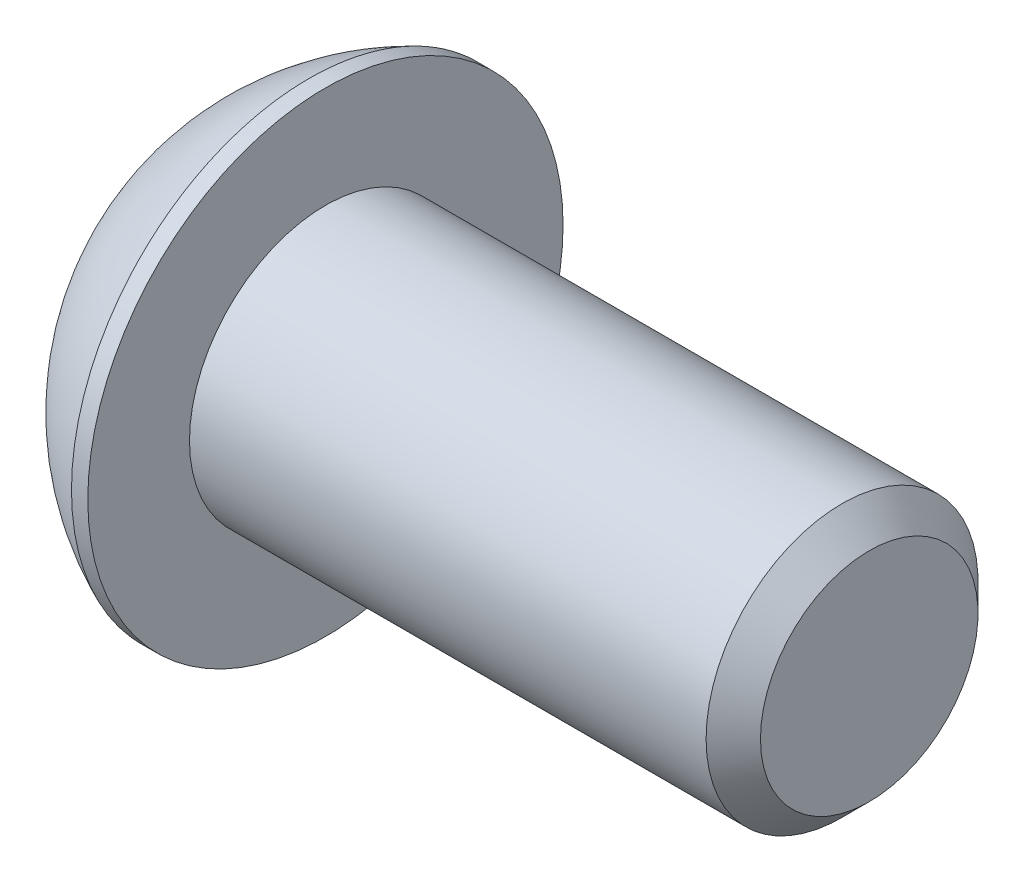
ISO-10303-21;
HEADER;
FILE_DESCRIPTION(('STEP AP214'),'2;1');
FILE_NAME('part.step','',(''),(''),'','','');
FILE_SCHEMA(('AUTOMOTIVE_DESIGN { 1 0 10303 214 1 1 1 1 }'));
ENDSEC;
DATA;
#1=APPLICATION_CONTEXT('core data for automotive mechanical design processes');
#2=APPLICATION_PROTOCOL_DEFINITION('international standard','automotive_design',2000,#1);
#3=PRODUCT_CONTEXT('',#1,'mechanical');
#4=PRODUCT('Part','Part','',(#3));
#5=PRODUCT_RELATED_PRODUCT_CATEGORY('part','',(#4));
#6=PRODUCT_DEFINITION_FORMATION('','',#4);
#7=PRODUCT_DEFINITION_CONTEXT('part definition',#1,'design');
#8=PRODUCT_DEFINITION('design','',#6,#7);
#9=PRODUCT_DEFINITION_SHAPE('','',#8);
#10=(LENGTH_UNIT() NAMED_UNIT(*) SI_UNIT(.MILLI.,.METRE.));
#11=(NAMED_UNIT(*) PLANE_ANGLE_UNIT() SI_UNIT($,.RADIAN.));
#12=(NAMED_UNIT(*) SI_UNIT($,.STERADIAN.) SOLID_ANGLE_UNIT());
#13=UNCERTAINTY_MEASURE_WITH_UNIT(LENGTH_MEASURE(1.E-05),#10,'distance_accuracy_value','');
#14=(GEOMETRIC_REPRESENTATION_CONTEXT(3) GLOBAL_UNCERTAINTY_ASSIGNED_CONTEXT((#13)) GLOBAL_UNIT_ASSIGNED_CONTEXT((#10,
#11,#12)) REPRESENTATION_CONTEXT('',''));
#15=CARTESIAN_POINT('',(0.,0.,0.));
#16=DIRECTION('',(0.,0.,1.));
#17=DIRECTION('',(1.,0.,0.));
#18=AXIS2_PLACEMENT_3D('',#15,#16,#17);
#19=CARTESIAN_POINT('',(1.32080000000034,0.,0.));
#20=DIRECTION('',(-1.,0.,0.));
#21=DIRECTION('',(0.,0.,1.));
#22=AXIS2_PLACEMENT_3D('',#19,#20,#21);
#23=CONICAL_SURFACE('',#22,1.1937999999998,1.04719755119608);
#24=CARTESIAN_POINT('',(2.01004075135902,0.,4.44089209850063E-13));
#25=VERTEX_POINT('',#24);
#26=VERTEX_LOOP('',#25);
#27=FACE_BOUND('',#26,.T.);
#28=CARTESIAN_POINT('',(1.32080000000009,0.,0.));
#29=DIRECTION('',(-1.,0.,0.));
#30=DIRECTION('',(0.,0.,1.));
#31=AXIS2_PLACEMENT_3D('',#28,#29,#30);
#32=CIRCLE('',#31,1.19380000000024);
#33=CARTESIAN_POINT('',(1.32080000000004,-1.03386112703797,0.59690000000006));
#34=VERTEX_POINT('',#33);
#35=CARTESIAN_POINT('',(1.32080000000004,0.,1.19380000000012));
#36=VERTEX_POINT('',#35);
#37=EDGE_CURVE('E20',#34,#36,#32,.T.);
#38=ORIENTED_EDGE('',*,*,#37,.T.);
#39=CARTESIAN_POINT('',(1.32080000000009,0.,0.));
#40=DIRECTION('',(-1.,0.,0.));
#41=DIRECTION('',(0.,0.,1.));
#42=AXIS2_PLACEMENT_3D('',#39,#40,#41);
#43=CIRCLE('',#42,1.19380000000024);
#44=CARTESIAN_POINT('',(1.32080000000004,1.03386112703797,0.596900000000061));
#45=VERTEX_POINT('',#44);
#46=EDGE_CURVE('E149',#36,#45,#43,.T.);
#47=ORIENTED_EDGE('',*,*,#46,.T.);
#48=CARTESIAN_POINT('',(1.32080000000009,0.,0.));
#49=DIRECTION('',(-1.,0.,0.));
#50=DIRECTION('',(0.,0.,1.));
#51=AXIS2_PLACEMENT_3D('',#48,#49,#50);
#52=CIRCLE('',#51,1.19380000000024);
#53=CARTESIAN_POINT('',(1.32080000000004,1.03386112703797,-0.596900000000061));
#54=VERTEX_POINT('',#53);
#55=EDGE_CURVE('E446',#45,#54,#52,.T.);
#56=ORIENTED_EDGE('',*,*,#55,.T.);
#57=CARTESIAN_POINT('',(1.32080000000009,0.,0.));
#58=DIRECTION('',(-1.,0.,0.));
#59=DIRECTION('',(0.,0.,1.));
#60=AXIS2_PLACEMENT_3D('',#57,#58,#59);
#61=CIRCLE('',#60,1.19380000000024);
#62=CARTESIAN_POINT('',(1.32080000000004,1.49457637585666E-12,-1.19380000000012));
#63=VERTEX_POINT('',#62);
#64=EDGE_CURVE('E447',#54,#63,#61,.T.);
#65=ORIENTED_EDGE('',*,*,#64,.T.);
#66=CARTESIAN_POINT('',(1.32080000000009,0.,0.));
#67=DIRECTION('',(-1.,0.,0.));
#68=DIRECTION('',(0.,0.,1.));
#69=AXIS2_PLACEMENT_3D('',#66,#67,#68);
#70=CIRCLE('',#69,1.19380000000024);
#71=CARTESIAN_POINT('',(1.32080000000004,-1.03386112703797,-0.59690000000006));
#72=VERTEX_POINT('',#71);
#73=EDGE_CURVE('E93',#63,#72,#70,.T.);
#74=ORIENTED_EDGE('',*,*,#73,.T.);
#75=CARTESIAN_POINT('',(1.32080000000009,0.,0.));
#76=DIRECTION('',(-1.,0.,0.));
#77=DIRECTION('',(0.,0.,1.));
#78=AXIS2_PLACEMENT_3D('',#75,#76,#77);
#79=CIRCLE('',#78,1.19380000000024);
#80=EDGE_CURVE('E89',#72,#34,#79,.T.);
#81=ORIENTED_EDGE('',*,*,#80,.T.);
#82=EDGE_LOOP('',(#38,#47,#56,#65,#74,#81));
#83=FACE_BOUND('',#82,.T.);
#84=ADVANCED_FACE('F17',(#27,#83),#23,.F.);
#85=CARTESIAN_POINT('',(1.3208,-2.06772225407572,-1.1938));
#86=DIRECTION('',(1.,0.,0.));
#87=DIRECTION('',(0.,0.,-1.));
#88=AXIS2_PLACEMENT_3D('',#85,#86,#87);
#89=PLANE('',#88);
#90=DIRECTION('',(0.,0.5,0.866025403784439));
#91=VECTOR('',#90,1.);
#92=CARTESIAN_POINT('',(1.3208,-1.37848150271715,0.));
#93=LINE('',#92,#91);
#94=CARTESIAN_POINT('',(1.3208,-0.689240751358574,1.1938));
#95=VERTEX_POINT('',#94);
#96=EDGE_CURVE('E101',#95,#34,#93,.F.);
#97=ORIENTED_EDGE('',*,*,#96,.F.);
#98=DIRECTION('',(0.,1.,0.));
#99=VECTOR('',#98,1.);
#100=CARTESIAN_POINT('',(1.3208,-0.689240751358574,1.1938));
#101=LINE('',#100,#99);
#102=EDGE_CURVE('E103',#36,#95,#101,.F.);
#103=ORIENTED_EDGE('',*,*,#102,.F.);
#104=ORIENTED_EDGE('',*,*,#37,.F.);
#105=EDGE_LOOP('',(#97,#103,#104));
#106=FACE_BOUND('',#105,.T.);
#107=ADVANCED_FACE('F99',(#106),#89,.F.);
#108=CARTESIAN_POINT('',(1.3208,-2.06772225407572,-1.1938));
#109=DIRECTION('',(1.,0.,0.));
#110=DIRECTION('',(0.,0.,-1.));
#111=AXIS2_PLACEMENT_3D('',#108,#109,#110);
#112=PLANE('',#111);
#113=DIRECTION('',(0.,-0.5,0.866025403784439));
#114=VECTOR('',#113,1.);
#115=CARTESIAN_POINT('',(1.3208,-0.689240751358574,-1.1938));
#116=LINE('',#115,#114);
#117=CARTESIAN_POINT('',(1.3208,-1.37848150271715,0.));
#118=VERTEX_POINT('',#117);
#119=EDGE_CURVE('E109',#118,#72,#116,.F.);
#120=ORIENTED_EDGE('',*,*,#119,.F.);
#121=DIRECTION('',(0.,0.5,0.866025403784439));
#122=VECTOR('',#121,1.);
#123=CARTESIAN_POINT('',(1.3208,-1.37848150271715,0.));
#124=LINE('',#123,#122);
#125=EDGE_CURVE('E106',#34,#118,#124,.F.);
#126=ORIENTED_EDGE('',*,*,#125,.F.);
#127=ORIENTED_EDGE('',*,*,#80,.F.);
#128=EDGE_LOOP('',(#120,#126,#127));
#129=FACE_BOUND('',#128,.T.);
#130=ADVANCED_FACE('F107',(#129),#112,.F.);
#131=CARTESIAN_POINT('',(1.3208,-2.06772225407572,-1.1938));
#132=DIRECTION('',(1.,0.,0.));
#133=DIRECTION('',(0.,0.,-1.));
#134=AXIS2_PLACEMENT_3D('',#131,#132,#133);
#135=PLANE('',#134);
#136=DIRECTION('',(0.,1.,0.));
#137=VECTOR('',#136,1.);
#138=CARTESIAN_POINT('',(1.3208,0.689240751358577,-1.1938));
#139=LINE('',#138,#137);
#140=CARTESIAN_POINT('',(1.3208,-0.689240751358574,-1.1938));
#141=VERTEX_POINT('',#140);
#142=EDGE_CURVE('E417',#141,#63,#139,.T.);
#143=ORIENTED_EDGE('',*,*,#142,.F.);
#144=DIRECTION('',(0.,-0.5,0.866025403784439));
#145=VECTOR('',#144,1.);
#146=CARTESIAN_POINT('',(1.3208,-0.689240751358574,-1.1938));
#147=LINE('',#146,#145);
#148=EDGE_CURVE('E429',#72,#141,#147,.F.);
#149=ORIENTED_EDGE('',*,*,#148,.F.);
#150=ORIENTED_EDGE('',*,*,#73,.F.);
#151=EDGE_LOOP('',(#143,#149,#150));
#152=FACE_BOUND('',#151,.T.);
#153=ADVANCED_FACE('F192',(#152),#135,.F.);
#154=CARTESIAN_POINT('',(1.3208,-2.06772225407572,-1.1938));
#155=DIRECTION('',(1.,0.,0.));
#156=DIRECTION('',(0.,0.,-1.));
#157=AXIS2_PLACEMENT_3D('',#154,#155,#156);
#158=PLANE('',#157);
#159=DIRECTION('',(0.,-0.5,-0.866025403784439));
#160=VECTOR('',#159,1.);
#161=CARTESIAN_POINT('',(1.3208,1.37848150271715,0.));
#162=LINE('',#161,#160);
#163=CARTESIAN_POINT('',(1.3208,0.689240751358576,-1.1938));
#164=VERTEX_POINT('',#163);
#165=EDGE_CURVE('E403',#164,#54,#162,.F.);
#166=ORIENTED_EDGE('',*,*,#165,.F.);
#167=DIRECTION('',(0.,1.,0.));
#168=VECTOR('',#167,1.);
#169=CARTESIAN_POINT('',(1.3208,0.689240751358577,-1.1938));
#170=LINE('',#169,#168);
#171=EDGE_CURVE('E414',#63,#164,#170,.T.);
#172=ORIENTED_EDGE('',*,*,#171,.F.);
#173=ORIENTED_EDGE('',*,*,#64,.F.);
#174=EDGE_LOOP('',(#166,#172,#173));
#175=FACE_BOUND('',#174,.T.);
#176=ADVANCED_FACE('F188',(#175),#158,.F.);
#177=CARTESIAN_POINT('',(1.3208,-2.06772225407572,-1.1938));
#178=DIRECTION('',(1.,0.,0.));
#179=DIRECTION('',(0.,0.,-1.));
#180=AXIS2_PLACEMENT_3D('',#177,#178,#179);
#181=PLANE('',#180);
#182=DIRECTION('',(0.,0.5,-0.866025403784439));
#183=VECTOR('',#182,1.);
#184=CARTESIAN_POINT('',(1.3208,0.689240751358577,1.1938));
#185=LINE('',#184,#183);
#186=CARTESIAN_POINT('',(1.3208,1.37848150271715,0.));
#187=VERTEX_POINT('',#186);
#188=EDGE_CURVE('E382',#187,#45,#185,.F.);
#189=ORIENTED_EDGE('',*,*,#188,.F.);
#190=DIRECTION('',(0.,-0.5,-0.866025403784439));
#191=VECTOR('',#190,1.);
#192=CARTESIAN_POINT('',(1.3208,1.37848150271715,0.));
#193=LINE('',#192,#191);
#194=EDGE_CURVE('E401',#54,#187,#193,.F.);
#195=ORIENTED_EDGE('',*,*,#194,.F.);
#196=ORIENTED_EDGE('',*,*,#55,.F.);
#197=EDGE_LOOP('',(#189,#195,#196));
#198=FACE_BOUND('',#197,.T.);
#199=ADVANCED_FACE('F184',(#198),#181,.F.);
#200=CARTESIAN_POINT('',(1.3208,-2.06772225407572,-1.1938));
#201=DIRECTION('',(1.,0.,0.));
#202=DIRECTION('',(0.,0.,-1.));
#203=AXIS2_PLACEMENT_3D('',#200,#201,#202);
#204=PLANE('',#203);
#205=DIRECTION('',(0.,1.,0.));
#206=VECTOR('',#205,1.);
#207=CARTESIAN_POINT('',(1.3208,-0.689240751358574,1.1938));
#208=LINE('',#207,#206);
#209=CARTESIAN_POINT('',(1.3208,0.689240751358577,1.1938));
#210=VERTEX_POINT('',#209);
#211=EDGE_CURVE('E118',#210,#36,#208,.F.);
#212=ORIENTED_EDGE('',*,*,#211,.F.);
#213=DIRECTION('',(0.,0.5,-0.866025403784439));
#214=VECTOR('',#213,1.);
#215=CARTESIAN_POINT('',(1.3208,0.689240751358577,1.1938));
#216=LINE('',#215,#214);
#217=EDGE_CURVE('E385',#45,#210,#216,.F.);
#218=ORIENTED_EDGE('',*,*,#217,.F.);
#219=ORIENTED_EDGE('',*,*,#46,.F.);
#220=EDGE_LOOP('',(#212,#218,#219));
#221=FACE_BOUND('',#220,.T.);
#222=ADVANCED_FACE('F180',(#221),#204,.F.);
#223=CARTESIAN_POINT('',(1.3208,-0.689240751358574,1.1938));
#224=DIRECTION('',(0.,0.,-1.));
#225=DIRECTION('',(0.,1.,0.));
#226=AXIS2_PLACEMENT_3D('',#223,#224,#225);
#227=PLANE('',#226);
#228=DIRECTION('',(0.,1.,0.));
#229=VECTOR('',#228,1.);
#230=CARTESIAN_POINT('',(0.,0.,1.1938));
#231=LINE('',#230,#229);
#232=CARTESIAN_POINT('',(0.,0.689240751358577,1.1938));
#233=VERTEX_POINT('',#232);
#234=CARTESIAN_POINT('',(0.,-0.689240751358574,1.1938));
#235=VERTEX_POINT('',#234);
#236=EDGE_CURVE('E379',#233,#235,#231,.F.);
#237=ORIENTED_EDGE('',*,*,#236,.F.);
#238=DIRECTION('',(1.,0.,0.));
#239=VECTOR('',#238,1.);
#240=CARTESIAN_POINT('',(1.3208,0.689240751358577,1.1938));
#241=LINE('',#240,#239);
#242=EDGE_CURVE('E391',#210,#233,#241,.F.);
#243=ORIENTED_EDGE('',*,*,#242,.F.);
#244=ORIENTED_EDGE('',*,*,#211,.T.);
#245=ORIENTED_EDGE('',*,*,#102,.T.);
#246=DIRECTION('',(1.,0.,0.));
#247=VECTOR('',#246,1.);
#248=CARTESIAN_POINT('',(1.3208,-0.689240751358574,1.1938));
#249=LINE('',#248,#247);
#250=EDGE_CURVE('E112',#235,#95,#249,.T.);
#251=ORIENTED_EDGE('',*,*,#250,.F.);
#252=EDGE_LOOP('',(#237,#243,#244,#245,#251));
#253=FACE_BOUND('',#252,.T.);
#254=ADVANCED_FACE('F177',(#253),#227,.T.);
#255=CARTESIAN_POINT('',(1.3208,-1.37848150271715,0.));
#256=DIRECTION('',(0.,0.866025403784439,-0.5));
#257=DIRECTION('',(0.,0.5,0.866025403784439));
#258=AXIS2_PLACEMENT_3D('',#255,#256,#257);
#259=PLANE('',#258);
#260=DIRECTION('',(0.,-0.5,-0.866025403784439));
#261=VECTOR('',#260,1.);
#262=CARTESIAN_POINT('',(0.,-0.689240751358574,1.1938));
#263=LINE('',#262,#261);
#264=CARTESIAN_POINT('',(0.,-1.37848150271715,0.));
#265=VERTEX_POINT('',#264);
#266=EDGE_CURVE('E376',#235,#265,#263,.T.);
#267=ORIENTED_EDGE('',*,*,#266,.F.);
#268=ORIENTED_EDGE('',*,*,#250,.T.);
#269=ORIENTED_EDGE('',*,*,#96,.T.);
#270=ORIENTED_EDGE('',*,*,#125,.T.);
#271=DIRECTION('',(1.,0.,0.));
#272=VECTOR('',#271,1.);
#273=CARTESIAN_POINT('',(1.3208,-1.37848150271715,0.));
#274=LINE('',#273,#272);
#275=EDGE_CURVE('E426',#265,#118,#274,.T.);
#276=ORIENTED_EDGE('',*,*,#275,.F.);
#277=EDGE_LOOP('',(#267,#268,#269,#270,#276));
#278=FACE_BOUND('',#277,.T.);
#279=ADVANCED_FACE('F116',(#278),#259,.T.);
#280=CARTESIAN_POINT('',(1.3208,-0.689240751358574,-1.1938));
#281=DIRECTION('',(0.,0.866025403784439,0.5));
#282=DIRECTION('',(0.,-0.5,0.866025403784439));
#283=AXIS2_PLACEMENT_3D('',#280,#281,#282);
#284=PLANE('',#283);
#285=DIRECTION('',(0.,0.5,-0.866025403784439));
#286=VECTOR('',#285,1.);
#287=CARTESIAN_POINT('',(0.,-1.37848150271715,0.));
#288=LINE('',#287,#286);
#289=CARTESIAN_POINT('',(0.,-0.689240751358574,-1.1938));
#290=VERTEX_POINT('',#289);
#291=EDGE_CURVE('E373',#265,#290,#288,.T.);
#292=ORIENTED_EDGE('',*,*,#291,.F.);
#293=ORIENTED_EDGE('',*,*,#275,.T.);
#294=ORIENTED_EDGE('',*,*,#119,.T.);
#295=ORIENTED_EDGE('',*,*,#148,.T.);
#296=DIRECTION('',(1.,0.,0.));
#297=VECTOR('',#296,1.);
#298=CARTESIAN_POINT('',(1.3208,-0.689240751358574,-1.1938));
#299=LINE('',#298,#297);
#300=EDGE_CURVE('E411',#290,#141,#299,.T.);
#301=ORIENTED_EDGE('',*,*,#300,.F.);
#302=EDGE_LOOP('',(#292,#293,#294,#295,#301));
#303=FACE_BOUND('',#302,.T.);
#304=ADVANCED_FACE('F170',(#303),#284,.T.);
#305=CARTESIAN_POINT('',(1.3208,0.689240751358577,-1.1938));
#306=DIRECTION('',(0.,0.,1.));
#307=DIRECTION('',(1.,0.,0.));
#308=AXIS2_PLACEMENT_3D('',#305,#306,#307);
#309=PLANE('',#308);
#310=DIRECTION('',(0.,1.,0.));
#311=VECTOR('',#310,1.);
#312=CARTESIAN_POINT('',(0.,0.,-1.1938));
#313=LINE('',#312,#311);
#314=CARTESIAN_POINT('',(0.,0.689240751358577,-1.1938));
#315=VERTEX_POINT('',#314);
#316=EDGE_CURVE('E370',#290,#315,#313,.T.);
#317=ORIENTED_EDGE('',*,*,#316,.F.);
#318=ORIENTED_EDGE('',*,*,#300,.T.);
#319=ORIENTED_EDGE('',*,*,#142,.T.);
#320=ORIENTED_EDGE('',*,*,#171,.T.);
#321=DIRECTION('',(1.,0.,0.));
#322=VECTOR('',#321,1.);
#323=CARTESIAN_POINT('',(1.3208,0.689240751358576,-1.1938));
#324=LINE('',#323,#322);
#325=EDGE_CURVE('E386',#315,#164,#324,.T.);
#326=ORIENTED_EDGE('',*,*,#325,.F.);
#327=EDGE_LOOP('',(#317,#318,#319,#320,#326));
#328=FACE_BOUND('',#327,.T.);
#329=ADVANCED_FACE('F167',(#328),#309,.T.);
#330=CARTESIAN_POINT('',(1.3208,1.37848150271715,0.));
#331=DIRECTION('',(0.,-0.866025403784439,0.5));
#332=DIRECTION('',(0.,-0.5,-0.866025403784439));
#333=AXIS2_PLACEMENT_3D('',#330,#331,#332);
#334=PLANE('',#333);
#335=DIRECTION('',(0.,0.5,0.866025403784439));
#336=VECTOR('',#335,1.);
#337=CARTESIAN_POINT('',(0.,0.689240751358577,-1.1938));
#338=LINE('',#337,#336);
#339=CARTESIAN_POINT('',(0.,1.37848150271715,0.));
#340=VERTEX_POINT('',#339);
#341=EDGE_CURVE('E367',#315,#340,#338,.T.);
#342=ORIENTED_EDGE('',*,*,#341,.F.);
#343=ORIENTED_EDGE('',*,*,#325,.T.);
#344=ORIENTED_EDGE('',*,*,#165,.T.);
#345=ORIENTED_EDGE('',*,*,#194,.T.);
#346=DIRECTION('',(1.,0.,0.));
#347=VECTOR('',#346,1.);
#348=CARTESIAN_POINT('',(1.3208,1.37848150271715,0.));
#349=LINE('',#348,#347);
#350=EDGE_CURVE('E35',#340,#187,#349,.T.);
#351=ORIENTED_EDGE('',*,*,#350,.F.);
#352=EDGE_LOOP('',(#342,#343,#344,#345,#351));
#353=FACE_BOUND('',#352,.T.);
#354=ADVANCED_FACE('F163',(#353),#334,.T.);
#355=CARTESIAN_POINT('',(1.3208,0.689240751358577,1.1938));
#356=DIRECTION('',(0.,-0.866025403784439,-0.5));
#357=DIRECTION('',(0.,0.5,-0.866025403784439));
#358=AXIS2_PLACEMENT_3D('',#355,#356,#357);
#359=PLANE('',#358);
#360=DIRECTION('',(0.,-0.5,0.866025403784439));
#361=VECTOR('',#360,1.);
#362=CARTESIAN_POINT('',(0.,1.37848150271715,0.));
#363=LINE('',#362,#361);
#364=EDGE_CURVE('E148',#340,#233,#363,.T.);
#365=ORIENTED_EDGE('',*,*,#364,.F.);
#366=ORIENTED_EDGE('',*,*,#350,.T.);
#367=ORIENTED_EDGE('',*,*,#188,.T.);
#368=ORIENTED_EDGE('',*,*,#217,.T.);
#369=ORIENTED_EDGE('',*,*,#242,.T.);
#370=EDGE_LOOP('',(#365,#366,#367,#368,#369));
#371=FACE_BOUND('',#370,.T.);
#372=ADVANCED_FACE('F159',(#371),#359,.T.);
#373=CARTESIAN_POINT('',(0.,0.,0.));
#374=DIRECTION('',(-1.,0.,0.));
#375=DIRECTION('',(0.,0.,1.));
#376=AXIS2_PLACEMENT_3D('',#373,#374,#375);
#377=PLANE('',#376);
#378=ORIENTED_EDGE('',*,*,#341,.T.);
#379=ORIENTED_EDGE('',*,*,#364,.T.);
#380=ORIENTED_EDGE('',*,*,#236,.T.);
#381=ORIENTED_EDGE('',*,*,#266,.T.);
#382=ORIENTED_EDGE('',*,*,#291,.T.);
#383=ORIENTED_EDGE('',*,*,#316,.T.);
#384=EDGE_LOOP('',(#378,#379,#380,#381,#382,#383));
#385=FACE_BOUND('',#384,.T.);
#386=CARTESIAN_POINT('',(0.,2.77495,0.));
#387=CARTESIAN_POINT('',(0.,2.77494953309947,0.077911893752346));
#388=CARTESIAN_POINT('',(0.,2.77166578388025,0.15583810591977));
#389=CARTESIAN_POINT('',(0.,2.75855213600204,0.311152012455904));
#390=CARTESIAN_POINT('',(0.,2.74872030471467,0.388539541019557));
#391=CARTESIAN_POINT('',(0.,2.72255472645677,0.542341518735718));
#392=CARTESIAN_POINT('',(-2.70127737992528E-13,2.70621065843662,0.618754223567578));
#393=CARTESIAN_POINT('',(2.712151197605E-13,2.66713326915777,0.769973634286023));
#394=CARTESIAN_POINT('',(1.01146133440994E-12,2.64439476297869,0.844778983646282));
#395=CARTESIAN_POINT('',(1.81647393794152E-12,2.5669019594335,1.06566239301792));
#396=CARTESIAN_POINT('',(4.75774730692854E-13,2.50280672569928,1.20857954243987));
#397=CARTESIAN_POINT('',(-4.74925440591424E-13,2.35149826934097,1.48160874561538));
#398=CARTESIAN_POINT('',(0.,2.26428416790397,1.61172031233499));
#399=CARTESIAN_POINT('',(0.,2.1181093928834,1.79445660654268));
#400=CARTESIAN_POINT('',(0.,2.06678693791626,1.85333128513996));
#401=CARTESIAN_POINT('',(0.,1.95940522984449,1.96650727912792));
#402=CARTESIAN_POINT('',(0.,1.90335059143535,2.02081294920044));
#403=CARTESIAN_POINT('',(0.,1.78683891013962,2.12453280878582));
#404=CARTESIAN_POINT('',(0.,1.72637988450322,2.1739447713554));
#405=CARTESIAN_POINT('',(0.,1.6015196886571,2.26750481692908));
#406=CARTESIAN_POINT('',(0.,1.53711760864537,2.31165167810847));
#407=CARTESIAN_POINT('',(0.,1.33869902291632,2.43567242603944));
#408=CARTESIAN_POINT('',(0.,1.19934704110695,2.507235886628));
#409=CARTESIAN_POINT('',(0.,0.910681609121878,2.62590828672821));
#410=CARTESIAN_POINT('',(0.,0.761368265357396,2.67301748742278));
#411=CARTESIAN_POINT('',(0.,0.456932649466621,2.74151230664007));
#412=CARTESIAN_POINT('',(0.,0.301810346322582,2.76289778778721));
#413=CARTESIAN_POINT('',(0.,-0.00982263870895374,2.77931595661155));
#414=CARTESIAN_POINT('',(0.,-0.16633332059645,2.77434864428876));
#415=CARTESIAN_POINT('',(0.,-0.476280836814454,2.73822217653072));
#416=CARTESIAN_POINT('',(0.,-0.629717687555988,2.70706316096981));
#417=CARTESIAN_POINT('',(0.,-0.929254830044276,2.61937980771149));
#418=CARTESIAN_POINT('',(0.,-1.0753550434132,2.56285519909568));
#419=CARTESIAN_POINT('',(0.,-1.28570692598579,2.46037024128109));
#420=CARTESIAN_POINT('',(0.,-1.35439130022287,2.42323494812896));
#421=CARTESIAN_POINT('',(0.,-1.488391287199,2.34331277270256));
#422=CARTESIAN_POINT('',(0.,-1.55370767631787,2.30052720108831));
#423=CARTESIAN_POINT('',(0.,-1.68047292776594,2.20962421887055));
#424=CARTESIAN_POINT('',(0.,-1.7419235278682,2.16150923122348));
#425=CARTESIAN_POINT('',(0.,-1.86060297067992,2.06024311301283));
#426=CARTESIAN_POINT('',(0.,-1.91782768181716,2.0070871669763));
#427=CARTESIAN_POINT('',(0.,-2.08239462196651,1.8407220856554));
#428=CARTESIAN_POINT('',(0.,-2.18279764272601,1.72049499758422));
#429=CARTESIAN_POINT('',(0.,-2.36195754944064,1.46487629213018));
#430=CARTESIAN_POINT('',(0.,-2.44071525816758,1.32948525142808));
#431=CARTESIAN_POINT('',(0.,-2.54098882695274,1.11796734074395));
#432=CARTESIAN_POINT('',(0.,-2.57146177392727,1.04596540008347));
#433=CARTESIAN_POINT('',(0.,-2.62621251108999,0.899689259475766));
#434=CARTESIAN_POINT('',(0.,-2.65049531495563,0.825416953360954));
#435=CARTESIAN_POINT('',(0.,-2.69267708798767,0.675215808695209));
#436=CARTESIAN_POINT('',(0.,-2.71058613777937,0.599289789313093));
#437=CARTESIAN_POINT('',(0.,-2.73994710360127,0.446213628496932));
#438=CARTESIAN_POINT('',(0.,-2.75140092413871,0.369063855024788));
#439=CARTESIAN_POINT('',(0.,-2.76470470685523,0.243162088173431));
#440=CARTESIAN_POINT('',(0.,-2.76854547596618,0.194611672428577));
#441=CARTESIAN_POINT('',(0.,-2.77366826843264,0.0973760351839812));
#442=CARTESIAN_POINT('',(0.,-2.77495029178814,0.0486908136842395));
#443=CARTESIAN_POINT('',(0.,-2.77494953309947,-0.0779118937523475));
#444=CARTESIAN_POINT('',(0.,-2.77166578388025,-0.155838105919772));
#445=CARTESIAN_POINT('',(0.,-2.75855213600205,-0.311152012455906));
#446=CARTESIAN_POINT('',(0.,-2.74872030471468,-0.388539541019558));
#447=CARTESIAN_POINT('',(0.,-2.72255472645677,-0.542341518735719));
#448=CARTESIAN_POINT('',(-2.70468893306326E-13,-2.70621065843662,-0.618754223567579));
#449=CARTESIAN_POINT('',(2.71556552501148E-13,-2.66713326915777,-0.769973634286024));
#450=CARTESIAN_POINT('',(1.01276822472601E-12,-2.64439476297869,-0.844778983646283));
#451=CARTESIAN_POINT('',(1.81906228830719E-12,-2.56690195943351,-1.06566239301792));
#452=CARTESIAN_POINT('',(4.77076449237947E-13,-2.50280672569928,-1.20857954243988));
#453=CARTESIAN_POINT('',(-4.76227208625583E-13,-2.35149826934097,-1.48160874561538));
#454=CARTESIAN_POINT('',(0.,-2.26428416790397,-1.61172031233499));
#455=CARTESIAN_POINT('',(0.,-2.1181093928834,-1.79445660654268));
#456=CARTESIAN_POINT('',(0.,-2.06678693791626,-1.85333128513997));
#457=CARTESIAN_POINT('',(0.,-1.95940522984449,-1.96650727912792));
#458=CARTESIAN_POINT('',(0.,-1.90335059143535,-2.02081294920044));
#459=CARTESIAN_POINT('',(0.,-1.78683891013962,-2.12453280878582));
#460=CARTESIAN_POINT('',(0.,-1.72637988450322,-2.1739447713554));
#461=CARTESIAN_POINT('',(0.,-1.6015196886571,-2.26750481692908));
#462=CARTESIAN_POINT('',(0.,-1.53711760864537,-2.31165167810847));
#463=CARTESIAN_POINT('',(0.,-1.33869902291631,-2.43567242603944));
#464=CARTESIAN_POINT('',(0.,-1.19934704110695,-2.507235886628));
#465=CARTESIAN_POINT('',(0.,-0.910681609121877,-2.62590828672821));
#466=CARTESIAN_POINT('',(0.,-0.761368265357394,-2.67301748742278));
#467=CARTESIAN_POINT('',(0.,-0.456932649466619,-2.74151230664007));
#468=CARTESIAN_POINT('',(0.,-0.30181034632258,-2.76289778778721));
#469=CARTESIAN_POINT('',(0.,0.0098226387089554,-2.77931595661155));
#470=CARTESIAN_POINT('',(0.,0.166333320596452,-2.77434864428876));
#471=CARTESIAN_POINT('',(0.,0.476280836814455,-2.73822217653072));
#472=CARTESIAN_POINT('',(0.,0.629717687555989,-2.70706316096981));
#473=CARTESIAN_POINT('',(0.,0.929254830044277,-2.61937980771149));
#474=CARTESIAN_POINT('',(0.,1.0753550434132,-2.56285519909568));
#475=CARTESIAN_POINT('',(0.,1.28570692598579,-2.46037024128108));
#476=CARTESIAN_POINT('',(0.,1.35439130022287,-2.42323494812896));
#477=CARTESIAN_POINT('',(0.,1.488391287199,-2.34331277270255));
#478=CARTESIAN_POINT('',(0.,1.55370767631787,-2.30052720108831));
#479=CARTESIAN_POINT('',(0.,1.68047292776595,-2.20962421887055));
#480=CARTESIAN_POINT('',(0.,1.7419235278682,-2.16150923122348));
#481=CARTESIAN_POINT('',(0.,1.86060297067992,-2.06024311301282));
#482=CARTESIAN_POINT('',(0.,1.91782768181715,-2.0070871669763));
#483=CARTESIAN_POINT('',(0.,2.08239462196651,-1.84072208565539));
#484=CARTESIAN_POINT('',(0.,2.18279764272601,-1.72049499758421));
#485=CARTESIAN_POINT('',(0.,2.36195754944064,-1.46487629213018));
#486=CARTESIAN_POINT('',(0.,2.44071525816758,-1.32948525142807));
#487=CARTESIAN_POINT('',(0.,2.54098882695274,-1.11796734074395));
#488=CARTESIAN_POINT('',(0.,2.57146177392727,-1.04596540008347));
#489=CARTESIAN_POINT('',(0.,2.62621251108998,-0.899689259475763));
#490=CARTESIAN_POINT('',(0.,2.65049531495563,-0.825416953360952));
#491=CARTESIAN_POINT('',(0.,2.69267708798767,-0.675215808695206));
#492=CARTESIAN_POINT('',(0.,2.71058613777937,-0.59928978931309));
#493=CARTESIAN_POINT('',(0.,2.73994710360127,-0.446213628496929));
#494=CARTESIAN_POINT('',(0.,2.7514009241387,-0.369063855024785));
#495=CARTESIAN_POINT('',(0.,2.76470470685522,-0.243162088173428));
#496=CARTESIAN_POINT('',(0.,2.76854547596618,-0.194611672428575));
#497=CARTESIAN_POINT('',(0.,2.77366826843264,-0.0973760351839809));
#498=CARTESIAN_POINT('',(0.,2.77495029178814,-0.04869081368424));
#499=CARTESIAN_POINT('',(0.,2.77495,0.));
#500=B_SPLINE_CURVE_WITH_KNOTS('',3,(#386,#387,#388,#389,#390,#391,#392,#393,#394,#395,#396,
#397,#398,#399,#400,#401,#402,#403,#404,#405,#406,#407,#408,#409,#410,#411,#412,#413,#414,#415,
#416,#417,#418,#419,#420,#421,#422,#423,#424,#425,#426,#427,#428,#429,#430,#431,#432,#433,#434,
#435,#436,#437,#438,#439,#440,#441,#442,#443,#444,#445,#446,#447,#448,#449,#450,#451,#452,#453,
#454,#455,#456,#457,#458,#459,#460,#461,#462,#463,#464,#465,#466,#467,#468,#469,#470,#471,#472,
#473,#474,#475,#476,#477,#478,#479,#480,#481,#482,#483,#484,#485,#486,#487,#488,#489,#490,#491,
#492,#493,#494,#495,#496,#497,#498,#499),.UNSPECIFIED.,.T.,.F.,(4,2,2,2,2,2,2,2,2,2,2,2,2,2,2,2,
2,2,2,2,2,2,2,2,2,2,2,2,2,2,2,2,2,2,2,2,2,2,2,2,2,2,2,2,2,2,2,2,2,2,2,2,2,2,2,2,4),(0.,
0.233690856748163,0.467450716578751,0.701582538521472,0.935904756015416,1.40343220467667,
1.87097742791502,2.10505636898837,2.33890962270652,2.57286880998746,2.80688218486306,
3.27442101763127,3.74195485676357,4.20949119271389,4.67702752866417,5.14456136779641,
5.61210020056468,5.84611357544033,6.08007276272136,6.31392601643949,6.54800495751272,
7.01555018075071,7.48307762941212,7.71739984690652,7.95153166884954,8.18529152868022,
8.41898238542855,8.56502681353347,8.71107124163842,8.94476209838658,9.17852195821717,
9.41265378015989,9.64697599765384,10.1145034463151,10.5820486695534,10.8161276106268,
11.0499808643449,11.2839400516259,11.5179534265015,11.9854922592697,12.453026098402,
12.9205624343523,13.3880987703026,13.8556326094348,14.3231714422031,14.5571848170788,
14.7911440043598,15.0249972580779,15.2590761991511,15.7266214223891,16.1941488710505,
16.4284710885449,16.662602910488,16.8963627703186,17.130053627067,17.2760980551719,
17.4221424832768),.UNSPECIFIED.);
#501=CARTESIAN_POINT('',(0.,2.77495,0.));
#502=VERTEX_POINT('',#501);
#503=EDGE_CURVE('E140',#502,#502,#500,.T.);
#504=ORIENTED_EDGE('',*,*,#503,.F.);
#505=EDGE_LOOP('',(#504));
#506=FACE_BOUND('',#505,.T.);
#507=ADVANCED_FACE('F155',(#385,#506),#377,.T.);
#508=CARTESIAN_POINT('',(5.37260881410257,0.,0.));
#509=DIRECTION('',(0.,1.,0.));
#510=DIRECTION('',(1.,0.,0.));
#511=AXIS2_PLACEMENT_3D('',#508,#509,#510);
#512=SPHERICAL_SURFACE('',#511,6.04692260343);
#513=CARTESIAN_POINT('',(2.9718,0.,0.));
#514=DIRECTION('',(-1.,0.,0.));
#515=DIRECTION('',(0.,0.,1.));
#516=AXIS2_PLACEMENT_3D('',#513,#514,#515);
#517=CIRCLE('',#516,5.5499);
#518=CARTESIAN_POINT('',(2.9718,0.,5.5499));
#519=VERTEX_POINT('',#518);
#520=EDGE_CURVE('E137',#519,#519,#517,.F.);
#521=ORIENTED_EDGE('',*,*,#520,.F.);
#522=EDGE_LOOP('',(#521));
#523=FACE_BOUND('',#522,.T.);
#524=ORIENTED_EDGE('',*,*,#503,.T.);
#525=EDGE_LOOP('',(#524));
#526=FACE_BOUND('',#525,.T.);
#527=ADVANCED_FACE('F151',(#523,#526),#512,.T.);
#528=CARTESIAN_POINT('',(16.0528,0.,0.));
#529=DIRECTION('',(-1.,0.,0.));
#530=DIRECTION('',(0.,0.,1.));
#531=AXIS2_PLACEMENT_3D('',#528,#529,#530);
#532=PLANE('',#531);
#533=CARTESIAN_POINT('',(16.0528000000681,0.,0.));
#534=DIRECTION('',(-1.,0.,0.));
#535=DIRECTION('',(0.,0.,1.));
#536=AXIS2_PLACEMENT_3D('',#533,#534,#535);
#537=CIRCLE('',#536,2.54000000001042);
#538=CARTESIAN_POINT('',(16.0528000000681,0.,2.54000000001042));
#539=VERTEX_POINT('',#538);
#540=EDGE_CURVE('E134',#539,#539,#537,.T.);
#541=ORIENTED_EDGE('',*,*,#540,.F.);
#542=EDGE_LOOP('',(#541));
#543=FACE_BOUND('',#542,.T.);
#544=ADVANCED_FACE('F222',(#543),#532,.F.);
#545=CARTESIAN_POINT('',(0.,0.,0.));
#546=DIRECTION('',(-1.,0.,0.));
#547=DIRECTION('',(0.,0.,1.));
#548=AXIS2_PLACEMENT_3D('',#545,#546,#547);
#549=CYLINDRICAL_SURFACE('',#548,5.5499);
#550=ORIENTED_EDGE('',*,*,#520,.T.);
#551=EDGE_LOOP('',(#550));
#552=FACE_BOUND('',#551,.T.);
#553=CARTESIAN_POINT('',(3.3528,0.,0.));
#554=DIRECTION('',(-1.,0.,0.));
#555=DIRECTION('',(0.,0.,1.));
#556=AXIS2_PLACEMENT_3D('',#553,#554,#555);
#557=CIRCLE('',#556,5.5499);
#558=CARTESIAN_POINT('',(3.3528,0.,5.5499));
#559=VERTEX_POINT('',#558);
#560=EDGE_CURVE('E131',#559,#559,#557,.T.);
#561=ORIENTED_EDGE('',*,*,#560,.T.);
#562=EDGE_LOOP('',(#561));
#563=FACE_BOUND('',#562,.T.);
#564=ADVANCED_FACE('F219',(#552,#563),#549,.T.);
#565=CARTESIAN_POINT('',(15.4178000000798,0.,0.));
#566=DIRECTION('',(-1.,0.,0.));
#567=DIRECTION('',(0.,0.,1.));
#568=AXIS2_PLACEMENT_3D('',#565,#566,#567);
#569=CONICAL_SURFACE('',#568,3.17499999999882,0.785398163397448);
#570=CARTESIAN_POINT('',(15.4178,0.,0.));
#571=DIRECTION('',(-1.,0.,0.));
#572=DIRECTION('',(0.,0.,1.));
#573=AXIS2_PLACEMENT_3D('',#570,#571,#572);
#574=CIRCLE('',#573,3.175);
#575=CARTESIAN_POINT('',(15.4178,0.,3.175));
#576=VERTEX_POINT('',#575);
#577=EDGE_CURVE('E26',#576,#576,#574,.T.);
#578=ORIENTED_EDGE('',*,*,#577,.F.);
#579=EDGE_LOOP('',(#578));
#580=FACE_BOUND('',#579,.T.);
#581=ORIENTED_EDGE('',*,*,#540,.T.);
#582=EDGE_LOOP('',(#581));
#583=FACE_BOUND('',#582,.T.);
#584=ADVANCED_FACE('F212',(#580,#583),#569,.T.);
#585=CARTESIAN_POINT('',(3.3528,3.175,0.));
#586=DIRECTION('',(-1.,0.,0.));
#587=DIRECTION('',(0.,0.,1.));
#588=AXIS2_PLACEMENT_3D('',#585,#586,#587);
#589=PLANE('',#588);
#590=CARTESIAN_POINT('',(3.3528,0.,0.));
#591=DIRECTION('',(-1.,0.,0.));
#592=DIRECTION('',(0.,0.,1.));
#593=AXIS2_PLACEMENT_3D('',#590,#591,#592);
#594=CIRCLE('',#593,3.175);
#595=CARTESIAN_POINT('',(3.3528,0.,3.175));
#596=VERTEX_POINT('',#595);
#597=EDGE_CURVE('E11',#596,#596,#594,.F.);
#598=ORIENTED_EDGE('',*,*,#597,.F.);
#599=EDGE_LOOP('',(#598));
#600=FACE_BOUND('',#599,.T.);
#601=ORIENTED_EDGE('',*,*,#560,.F.);
#602=EDGE_LOOP('',(#601));
#603=FACE_BOUND('',#602,.T.);
#604=ADVANCED_FACE('F206',(#600,#603),#589,.F.);
#605=CARTESIAN_POINT('',(0.,0.,0.));
#606=DIRECTION('',(-1.,0.,0.));
#607=DIRECTION('',(0.,0.,1.));
#608=AXIS2_PLACEMENT_3D('',#605,#606,#607);
#609=CYLINDRICAL_SURFACE('',#608,3.175);
#610=ORIENTED_EDGE('',*,*,#597,.T.);
#611=EDGE_LOOP('',(#610));
#612=FACE_BOUND('',#611,.T.);
#613=ORIENTED_EDGE('',*,*,#577,.T.);
#614=EDGE_LOOP('',(#613));
#615=FACE_BOUND('',#614,.T.);
#616=ADVANCED_FACE('F204',(#612,#615),#609,.T.);
#617=CLOSED_SHELL('',(#84,#107,#130,#153,#176,#199,#222,#254,#279,#304,#329,#354,#372,#507,#527,
#544,#564,#584,#604,#616));
#618=MANIFOLD_SOLID_BREP('B1',#617);
#619=ADVANCED_BREP_SHAPE_REPRESENTATION('',(#18,#618),#14);
#620=SHAPE_DEFINITION_REPRESENTATION(#9,#619);
ENDSEC;
END-ISO-10303-21;
